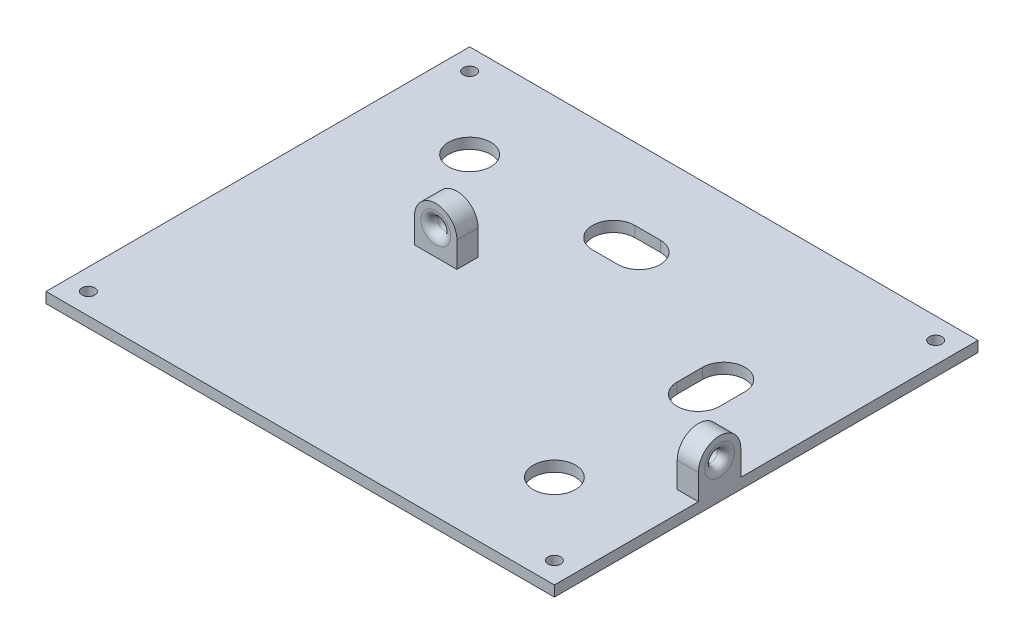
ISO-10303-21;
HEADER;
FILE_DESCRIPTION(('STEP AP214'),'2;1');
FILE_NAME('part.step','',(''),(''),'','','');
FILE_SCHEMA(('AUTOMOTIVE_DESIGN { 1 0 10303 214 1 1 1 1 }'));
ENDSEC;
DATA;
#1=APPLICATION_CONTEXT('core data for automotive mechanical design processes');
#2=APPLICATION_PROTOCOL_DEFINITION('international standard','automotive_design',2000,#1);
#3=PRODUCT_CONTEXT('',#1,'mechanical');
#4=PRODUCT('Part','Part','',(#3));
#5=PRODUCT_RELATED_PRODUCT_CATEGORY('part','',(#4));
#6=PRODUCT_DEFINITION_FORMATION('','',#4);
#7=PRODUCT_DEFINITION_CONTEXT('part definition',#1,'design');
#8=PRODUCT_DEFINITION('design','',#6,#7);
#9=PRODUCT_DEFINITION_SHAPE('','',#8);
#10=(LENGTH_UNIT() NAMED_UNIT(*) SI_UNIT(.MILLI.,.METRE.));
#11=(NAMED_UNIT(*) PLANE_ANGLE_UNIT() SI_UNIT($,.RADIAN.));
#12=(NAMED_UNIT(*) SI_UNIT($,.STERADIAN.) SOLID_ANGLE_UNIT());
#13=UNCERTAINTY_MEASURE_WITH_UNIT(LENGTH_MEASURE(1.E-05),#10,'distance_accuracy_value','');
#14=(GEOMETRIC_REPRESENTATION_CONTEXT(3) GLOBAL_UNCERTAINTY_ASSIGNED_CONTEXT((#13)) GLOBAL_UNIT_ASSIGNED_CONTEXT((#10,
#11,#12)) REPRESENTATION_CONTEXT('',''));
#15=CARTESIAN_POINT('',(0.,0.,0.));
#16=DIRECTION('',(0.,0.,1.));
#17=DIRECTION('',(1.,0.,0.));
#18=AXIS2_PLACEMENT_3D('',#15,#16,#17);
#19=CARTESIAN_POINT('',(-60.,2.5,-50.));
#20=DIRECTION('',(0.,0.,1.));
#21=DIRECTION('',(1.,0.,0.));
#22=AXIS2_PLACEMENT_3D('',#19,#20,#21);
#23=PLANE('',#22);
#24=DIRECTION('',(0.,-1.,0.));
#25=VECTOR('',#24,1.);
#26=CARTESIAN_POINT('',(-60.,2.5,-50.));
#27=LINE('',#26,#25);
#28=CARTESIAN_POINT('',(-60.,2.5,-50.));
#29=VERTEX_POINT('',#28);
#30=CARTESIAN_POINT('',(-60.,0.,-50.));
#31=VERTEX_POINT('',#30);
#32=EDGE_CURVE('E305',#29,#31,#27,.T.);
#33=ORIENTED_EDGE('',*,*,#32,.F.);
#34=DIRECTION('',(-1.,0.,0.));
#35=VECTOR('',#34,1.);
#36=CARTESIAN_POINT('',(-60.,2.5,-50.));
#37=LINE('',#36,#35);
#38=CARTESIAN_POINT('',(60.,2.5,-50.));
#39=VERTEX_POINT('',#38);
#40=EDGE_CURVE('E282',#39,#29,#37,.T.);
#41=ORIENTED_EDGE('',*,*,#40,.F.);
#42=DIRECTION('',(0.,-1.,0.));
#43=VECTOR('',#42,1.);
#44=CARTESIAN_POINT('',(60.,2.5,-50.));
#45=LINE('',#44,#43);
#46=CARTESIAN_POINT('',(60.,0.,-50.));
#47=VERTEX_POINT('',#46);
#48=EDGE_CURVE('E308',#39,#47,#45,.T.);
#49=ORIENTED_EDGE('',*,*,#48,.T.);
#50=DIRECTION('',(-1.,0.,0.));
#51=VECTOR('',#50,1.);
#52=CARTESIAN_POINT('',(-60.,0.,-50.));
#53=LINE('',#52,#51);
#54=EDGE_CURVE('E293',#47,#31,#53,.T.);
#55=ORIENTED_EDGE('',*,*,#54,.T.);
#56=EDGE_LOOP('',(#33,#41,#49,#55));
#57=FACE_BOUND('',#56,.T.);
#58=ADVANCED_FACE('F33',(#57),#23,.F.);
#59=CARTESIAN_POINT('',(55.,17.5,16.));
#60=DIRECTION('',(0.,0.,-1.));
#61=DIRECTION('',(-1.,0.,0.));
#62=AXIS2_PLACEMENT_3D('',#59,#60,#61);
#63=PLANE('',#62);
#64=DIRECTION('',(-1.,0.,0.));
#65=VECTOR('',#64,1.);
#66=CARTESIAN_POINT('',(60.,8.5,16.));
#67=LINE('',#66,#65);
#68=CARTESIAN_POINT('',(60.,8.5,16.));
#69=VERTEX_POINT('',#68);
#70=CARTESIAN_POINT('',(55.,8.5,16.));
#71=VERTEX_POINT('',#70);
#72=EDGE_CURVE('E168',#69,#71,#67,.T.);
#73=ORIENTED_EDGE('',*,*,#72,.T.);
#74=DIRECTION('',(0.,-1.,0.));
#75=VECTOR('',#74,1.);
#76=CARTESIAN_POINT('',(55.,17.5,16.));
#77=LINE('',#76,#75);
#78=CARTESIAN_POINT('',(55.,2.5,16.));
#79=VERTEX_POINT('',#78);
#80=EDGE_CURVE('E190',#71,#79,#77,.T.);
#81=ORIENTED_EDGE('',*,*,#80,.T.);
#82=DIRECTION('',(1.,0.,0.));
#83=VECTOR('',#82,1.);
#84=CARTESIAN_POINT('',(55.,2.5,16.));
#85=LINE('',#84,#83);
#86=CARTESIAN_POINT('',(60.,2.5,16.));
#87=VERTEX_POINT('',#86);
#88=EDGE_CURVE('E189',#79,#87,#85,.T.);
#89=ORIENTED_EDGE('',*,*,#88,.T.);
#90=DIRECTION('',(0.,-1.,0.));
#91=VECTOR('',#90,1.);
#92=CARTESIAN_POINT('',(60.,17.5,16.));
#93=LINE('',#92,#91);
#94=EDGE_CURVE('E181',#69,#87,#93,.T.);
#95=ORIENTED_EDGE('',*,*,#94,.F.);
#96=EDGE_LOOP('',(#73,#81,#89,#95));
#97=FACE_BOUND('',#96,.T.);
#98=ADVANCED_FACE('F187',(#97),#63,.F.);
#99=CARTESIAN_POINT('',(-16.,17.5,-8.00000000000001));
#100=DIRECTION('',(-1.,0.,0.));
#101=DIRECTION('',(0.,0.,1.));
#102=AXIS2_PLACEMENT_3D('',#99,#100,#101);
#103=PLANE('',#102);
#104=DIRECTION('',(0.,0.,1.));
#105=VECTOR('',#104,1.);
#106=CARTESIAN_POINT('',(-16.,8.5,-50.));
#107=LINE('',#106,#105);
#108=CARTESIAN_POINT('',(-16.,8.5,-8.00000000000001));
#109=VERTEX_POINT('',#108);
#110=CARTESIAN_POINT('',(-16.,8.5,-3.00000000000001));
#111=VERTEX_POINT('',#110);
#112=EDGE_CURVE('E56',#109,#111,#107,.T.);
#113=ORIENTED_EDGE('',*,*,#112,.T.);
#114=DIRECTION('',(0.,-1.,0.));
#115=VECTOR('',#114,1.);
#116=CARTESIAN_POINT('',(-16.,17.5,-3.00000000000001));
#117=LINE('',#116,#115);
#118=CARTESIAN_POINT('',(-16.,2.5,-3.00000000000001));
#119=VERTEX_POINT('',#118);
#120=EDGE_CURVE('E213',#111,#119,#117,.T.);
#121=ORIENTED_EDGE('',*,*,#120,.T.);
#122=DIRECTION('',(0.,0.,-1.));
#123=VECTOR('',#122,1.);
#124=CARTESIAN_POINT('',(-16.,2.5,-8.00000000000001));
#125=LINE('',#124,#123);
#126=CARTESIAN_POINT('',(-16.,2.5,-8.00000000000001));
#127=VERTEX_POINT('',#126);
#128=EDGE_CURVE('E203',#119,#127,#125,.T.);
#129=ORIENTED_EDGE('',*,*,#128,.T.);
#130=DIRECTION('',(0.,-1.,0.));
#131=VECTOR('',#130,1.);
#132=CARTESIAN_POINT('',(-16.,17.5,-8.00000000000001));
#133=LINE('',#132,#131);
#134=EDGE_CURVE('E211',#109,#127,#133,.T.);
#135=ORIENTED_EDGE('',*,*,#134,.F.);
#136=EDGE_LOOP('',(#113,#121,#129,#135));
#137=FACE_BOUND('',#136,.T.);
#138=ADVANCED_FACE('F452',(#137),#103,.F.);
#139=CARTESIAN_POINT('',(0.,2.5,0.));
#140=DIRECTION('',(0.,1.,0.));
#141=DIRECTION('',(0.,0.,1.));
#142=AXIS2_PLACEMENT_3D('',#139,#140,#141);
#143=PLANE('',#142);
#144=ORIENTED_EDGE('',*,*,#40,.T.);
#145=DIRECTION('',(0.,0.,1.));
#146=VECTOR('',#145,1.);
#147=CARTESIAN_POINT('',(-60.,2.5,-50.));
#148=LINE('',#147,#146);
#149=CARTESIAN_POINT('',(-60.,2.5,50.));
#150=VERTEX_POINT('',#149);
#151=EDGE_CURVE('E285',#29,#150,#148,.T.);
#152=ORIENTED_EDGE('',*,*,#151,.T.);
#153=DIRECTION('',(1.,0.,0.));
#154=VECTOR('',#153,1.);
#155=CARTESIAN_POINT('',(-60.,2.5,50.));
#156=LINE('',#155,#154);
#157=CARTESIAN_POINT('',(60.,2.5,50.));
#158=VERTEX_POINT('',#157);
#159=EDGE_CURVE('E287',#150,#158,#156,.T.);
#160=ORIENTED_EDGE('',*,*,#159,.T.);
#161=DIRECTION('',(0.,0.,-1.));
#162=VECTOR('',#161,1.);
#163=CARTESIAN_POINT('',(60.,2.5,-50.));
#164=LINE('',#163,#162);
#165=EDGE_CURVE('E280',#158,#87,#164,.T.);
#166=ORIENTED_EDGE('',*,*,#165,.T.);
#167=ORIENTED_EDGE('',*,*,#88,.F.);
#168=DIRECTION('',(0.,0.,1.));
#169=VECTOR('',#168,1.);
#170=CARTESIAN_POINT('',(55.,2.5,16.));
#171=LINE('',#170,#169);
#172=CARTESIAN_POINT('',(55.,2.5,5.99999999999999));
#173=VERTEX_POINT('',#172);
#174=EDGE_CURVE('E395',#173,#79,#171,.T.);
#175=ORIENTED_EDGE('',*,*,#174,.F.);
#176=DIRECTION('',(-1.,0.,0.));
#177=VECTOR('',#176,1.);
#178=CARTESIAN_POINT('',(55.,2.5,5.99999999999999));
#179=LINE('',#178,#177);
#180=CARTESIAN_POINT('',(60.,2.5,6.));
#181=VERTEX_POINT('',#180);
#182=EDGE_CURVE('E405',#181,#173,#179,.T.);
#183=ORIENTED_EDGE('',*,*,#182,.F.);
#184=EDGE_CURVE('E283',#181,#39,#164,.T.);
#185=ORIENTED_EDGE('',*,*,#184,.T.);
#186=EDGE_LOOP('',(#144,#152,#160,#166,#167,#175,#183,#185));
#187=FACE_BOUND('',#186,.T.);
#188=DIRECTION('',(-1.,0.,0.));
#189=VECTOR('',#188,1.);
#190=CARTESIAN_POINT('',(-4.00000000000001,2.5,-33.));
#191=LINE('',#190,#189);
#192=CARTESIAN_POINT('',(1.99999999999999,2.5,-33.));
#193=VERTEX_POINT('',#192);
#194=CARTESIAN_POINT('',(-4.00000000000001,2.5,-33.));
#195=VERTEX_POINT('',#194);
#196=EDGE_CURVE('E225',#193,#195,#191,.T.);
#197=ORIENTED_EDGE('',*,*,#196,.F.);
#198=CARTESIAN_POINT('',(1.99999999999999,2.5,-28.));
#199=DIRECTION('',(0.,1.,0.));
#200=DIRECTION('',(0.,0.,1.));
#201=AXIS2_PLACEMENT_3D('',#198,#199,#200);
#202=CIRCLE('',#201,5.);
#203=CARTESIAN_POINT('',(1.99999999999999,2.5,-23.));
#204=VERTEX_POINT('',#203);
#205=EDGE_CURVE('E221',#204,#193,#202,.T.);
#206=ORIENTED_EDGE('',*,*,#205,.F.);
#207=DIRECTION('',(1.,0.,0.));
#208=VECTOR('',#207,1.);
#209=CARTESIAN_POINT('',(-4.00000000000001,2.5,-23.));
#210=LINE('',#209,#208);
#211=CARTESIAN_POINT('',(-4.00000000000001,2.5,-23.));
#212=VERTEX_POINT('',#211);
#213=EDGE_CURVE('E218',#212,#204,#210,.T.);
#214=ORIENTED_EDGE('',*,*,#213,.F.);
#215=CARTESIAN_POINT('',(-4.00000000000001,2.5,-28.));
#216=DIRECTION('',(0.,1.,0.));
#217=DIRECTION('',(0.,0.,1.));
#218=AXIS2_PLACEMENT_3D('',#215,#216,#217);
#219=CIRCLE('',#218,5.);
#220=EDGE_CURVE('E258',#195,#212,#219,.T.);
#221=ORIENTED_EDGE('',*,*,#220,.F.);
#222=EDGE_LOOP('',(#197,#206,#214,#221));
#223=FACE_BOUND('',#222,.T.);
#224=DIRECTION('',(0.,0.,1.));
#225=VECTOR('',#224,1.);
#226=CARTESIAN_POINT('',(33.,2.5,-6.00000000000001));
#227=LINE('',#226,#225);
#228=CARTESIAN_POINT('',(33.,2.5,-12.));
#229=VERTEX_POINT('',#228);
#230=CARTESIAN_POINT('',(33.,2.5,-6.00000000000001));
#231=VERTEX_POINT('',#230);
#232=EDGE_CURVE('E237',#229,#231,#227,.T.);
#233=ORIENTED_EDGE('',*,*,#232,.F.);
#234=CARTESIAN_POINT('',(38.,2.5,-12.));
#235=DIRECTION('',(0.,1.,0.));
#236=DIRECTION('',(0.,0.,1.));
#237=AXIS2_PLACEMENT_3D('',#234,#235,#236);
#238=CIRCLE('',#237,5.);
#239=CARTESIAN_POINT('',(43.,2.5,-12.));
#240=VERTEX_POINT('',#239);
#241=EDGE_CURVE('E234',#240,#229,#238,.T.);
#242=ORIENTED_EDGE('',*,*,#241,.F.);
#243=DIRECTION('',(0.,0.,-1.));
#244=VECTOR('',#243,1.);
#245=CARTESIAN_POINT('',(43.,2.5,-6.00000000000001));
#246=LINE('',#245,#244);
#247=CARTESIAN_POINT('',(43.,2.5,-6.00000000000001));
#248=VERTEX_POINT('',#247);
#249=EDGE_CURVE('E217',#248,#240,#246,.T.);
#250=ORIENTED_EDGE('',*,*,#249,.F.);
#251=CARTESIAN_POINT('',(38.,2.5,-6.00000000000001));
#252=DIRECTION('',(0.,1.,0.));
#253=DIRECTION('',(0.,0.,1.));
#254=AXIS2_PLACEMENT_3D('',#251,#252,#253);
#255=CIRCLE('',#254,5.);
#256=EDGE_CURVE('E261',#231,#248,#255,.T.);
#257=ORIENTED_EDGE('',*,*,#256,.F.);
#258=EDGE_LOOP('',(#233,#242,#250,#257));
#259=FACE_BOUND('',#258,.T.);
#260=CARTESIAN_POINT('',(-38.,2.5,-28.));
#261=DIRECTION('',(0.,1.,0.));
#262=DIRECTION('',(0.,0.,1.));
#263=AXIS2_PLACEMENT_3D('',#260,#261,#262);
#264=CIRCLE('',#263,5.);
#265=CARTESIAN_POINT('',(-38.,2.5,-23.));
#266=VERTEX_POINT('',#265);
#267=EDGE_CURVE('E254',#266,#266,#264,.T.);
#268=ORIENTED_EDGE('',*,*,#267,.F.);
#269=EDGE_LOOP('',(#268));
#270=FACE_BOUND('',#269,.T.);
#271=CARTESIAN_POINT('',(38.,2.5,28.));
#272=DIRECTION('',(0.,1.,0.));
#273=DIRECTION('',(0.,0.,1.));
#274=AXIS2_PLACEMENT_3D('',#271,#272,#273);
#275=CIRCLE('',#274,5.);
#276=CARTESIAN_POINT('',(38.,2.5,33.));
#277=VERTEX_POINT('',#276);
#278=EDGE_CURVE('E253',#277,#277,#275,.T.);
#279=ORIENTED_EDGE('',*,*,#278,.F.);
#280=EDGE_LOOP('',(#279));
#281=FACE_BOUND('',#280,.T.);
#282=CARTESIAN_POINT('',(-55.,2.5,45.));
#283=DIRECTION('',(0.,1.,0.));
#284=DIRECTION('',(0.,0.,1.));
#285=AXIS2_PLACEMENT_3D('',#282,#283,#284);
#286=CIRCLE('',#285,1.5);
#287=CARTESIAN_POINT('',(-55.,2.5,46.5));
#288=VERTEX_POINT('',#287);
#289=EDGE_CURVE('E273',#288,#288,#286,.T.);
#290=ORIENTED_EDGE('',*,*,#289,.F.);
#291=EDGE_LOOP('',(#290));
#292=FACE_BOUND('',#291,.T.);
#293=CARTESIAN_POINT('',(55.,2.5,45.));
#294=DIRECTION('',(0.,1.,0.));
#295=DIRECTION('',(0.,0.,1.));
#296=AXIS2_PLACEMENT_3D('',#293,#294,#295);
#297=CIRCLE('',#296,1.5);
#298=CARTESIAN_POINT('',(55.,2.5,46.5));
#299=VERTEX_POINT('',#298);
#300=EDGE_CURVE('E270',#299,#299,#297,.T.);
#301=ORIENTED_EDGE('',*,*,#300,.F.);
#302=EDGE_LOOP('',(#301));
#303=FACE_BOUND('',#302,.T.);
#304=CARTESIAN_POINT('',(55.,2.5,-45.));
#305=DIRECTION('',(0.,1.,0.));
#306=DIRECTION('',(0.,0.,1.));
#307=AXIS2_PLACEMENT_3D('',#304,#305,#306);
#308=CIRCLE('',#307,1.5);
#309=CARTESIAN_POINT('',(55.,2.5,-43.5));
#310=VERTEX_POINT('',#309);
#311=EDGE_CURVE('E266',#310,#310,#308,.T.);
#312=ORIENTED_EDGE('',*,*,#311,.F.);
#313=EDGE_LOOP('',(#312));
#314=FACE_BOUND('',#313,.T.);
#315=CARTESIAN_POINT('',(-55.,2.5,-45.));
#316=DIRECTION('',(0.,1.,0.));
#317=DIRECTION('',(0.,0.,1.));
#318=AXIS2_PLACEMENT_3D('',#315,#316,#317);
#319=CIRCLE('',#318,1.5);
#320=CARTESIAN_POINT('',(-55.,2.5,-43.5));
#321=VERTEX_POINT('',#320);
#322=EDGE_CURVE('E269',#321,#321,#319,.T.);
#323=ORIENTED_EDGE('',*,*,#322,.F.);
#324=EDGE_LOOP('',(#323));
#325=FACE_BOUND('',#324,.T.);
#326=DIRECTION('',(1.,0.,0.));
#327=VECTOR('',#326,1.);
#328=CARTESIAN_POINT('',(-26.,2.5,-3.00000000000001));
#329=LINE('',#328,#327);
#330=CARTESIAN_POINT('',(-26.,2.5,-3.00000000000001));
#331=VERTEX_POINT('',#330);
#332=EDGE_CURVE('E200',#331,#119,#329,.T.);
#333=ORIENTED_EDGE('',*,*,#332,.F.);
#334=DIRECTION('',(0.,0.,1.));
#335=VECTOR('',#334,1.);
#336=CARTESIAN_POINT('',(-26.,2.5,-8.00000000000001));
#337=LINE('',#336,#335);
#338=CARTESIAN_POINT('',(-26.,2.5,-8.00000000000001));
#339=VERTEX_POINT('',#338);
#340=EDGE_CURVE('E192',#339,#331,#337,.T.);
#341=ORIENTED_EDGE('',*,*,#340,.F.);
#342=DIRECTION('',(-1.,0.,0.));
#343=VECTOR('',#342,1.);
#344=CARTESIAN_POINT('',(-26.,2.5,-8.00000000000001));
#345=LINE('',#344,#343);
#346=EDGE_CURVE('E206',#127,#339,#345,.T.);
#347=ORIENTED_EDGE('',*,*,#346,.F.);
#348=ORIENTED_EDGE('',*,*,#128,.F.);
#349=EDGE_LOOP('',(#333,#341,#347,#348));
#350=FACE_BOUND('',#349,.T.);
#351=ADVANCED_FACE('F413',(#187,#223,#259,#270,#281,#292,#303,#314,#325,#350),#143,.T.);
#352=CARTESIAN_POINT('',(38.,-2.5,-6.00000000000001));
#353=DIRECTION('',(0.,1.,0.));
#354=DIRECTION('',(0.,0.,1.));
#355=AXIS2_PLACEMENT_3D('',#352,#353,#354);
#356=CYLINDRICAL_SURFACE('',#355,5.);
#357=DIRECTION('',(0.,1.,0.));
#358=VECTOR('',#357,1.);
#359=CARTESIAN_POINT('',(33.,-2.5,-6.00000000000001));
#360=LINE('',#359,#358);
#361=CARTESIAN_POINT('',(33.,0.,-6.00000000000001));
#362=VERTEX_POINT('',#361);
#363=EDGE_CURVE('E339',#231,#362,#360,.F.);
#364=ORIENTED_EDGE('',*,*,#363,.F.);
#365=ORIENTED_EDGE('',*,*,#256,.T.);
#366=DIRECTION('',(0.,1.,0.));
#367=VECTOR('',#366,1.);
#368=CARTESIAN_POINT('',(43.,-2.5,-6.00000000000001));
#369=LINE('',#368,#367);
#370=CARTESIAN_POINT('',(43.,0.,-6.00000000000001));
#371=VERTEX_POINT('',#370);
#372=EDGE_CURVE('E336',#248,#371,#369,.F.);
#373=ORIENTED_EDGE('',*,*,#372,.T.);
#374=CARTESIAN_POINT('',(38.,0.,-6.00000000000001));
#375=DIRECTION('',(0.,1.,0.));
#376=DIRECTION('',(0.,0.,1.));
#377=AXIS2_PLACEMENT_3D('',#374,#375,#376);
#378=CIRCLE('',#377,5.);
#379=EDGE_CURVE('E324',#362,#371,#378,.T.);
#380=ORIENTED_EDGE('',*,*,#379,.F.);
#381=EDGE_LOOP('',(#364,#365,#373,#380));
#382=FACE_BOUND('',#381,.T.);
#383=ADVANCED_FACE('F530',(#382),#356,.F.);
#384=CARTESIAN_POINT('',(-4.00000000000001,-2.5,-28.));
#385=DIRECTION('',(0.,1.,0.));
#386=DIRECTION('',(0.,0.,1.));
#387=AXIS2_PLACEMENT_3D('',#384,#385,#386);
#388=CYLINDRICAL_SURFACE('',#387,5.);
#389=DIRECTION('',(0.,1.,0.));
#390=VECTOR('',#389,1.);
#391=CARTESIAN_POINT('',(-4.00000000000001,-2.5,-33.));
#392=LINE('',#391,#390);
#393=CARTESIAN_POINT('',(-4.00000000000001,0.,-33.));
#394=VERTEX_POINT('',#393);
#395=EDGE_CURVE('E334',#195,#394,#392,.F.);
#396=ORIENTED_EDGE('',*,*,#395,.F.);
#397=ORIENTED_EDGE('',*,*,#220,.T.);
#398=DIRECTION('',(0.,1.,0.));
#399=VECTOR('',#398,1.);
#400=CARTESIAN_POINT('',(-4.00000000000001,-2.5,-23.));
#401=LINE('',#400,#399);
#402=CARTESIAN_POINT('',(-4.00000000000001,0.,-23.));
#403=VERTEX_POINT('',#402);
#404=EDGE_CURVE('E311',#212,#403,#401,.F.);
#405=ORIENTED_EDGE('',*,*,#404,.T.);
#406=CARTESIAN_POINT('',(-4.00000000000001,0.,-28.));
#407=DIRECTION('',(0.,1.,0.));
#408=DIRECTION('',(0.,0.,1.));
#409=AXIS2_PLACEMENT_3D('',#406,#407,#408);
#410=CIRCLE('',#409,5.);
#411=EDGE_CURVE('E327',#394,#403,#410,.T.);
#412=ORIENTED_EDGE('',*,*,#411,.F.);
#413=EDGE_LOOP('',(#396,#397,#405,#412));
#414=FACE_BOUND('',#413,.T.);
#415=ADVANCED_FACE('F458',(#414),#388,.F.);
#416=CARTESIAN_POINT('',(60.,2.5,-50.));
#417=DIRECTION('',(-1.,0.,0.));
#418=DIRECTION('',(0.,0.,1.));
#419=AXIS2_PLACEMENT_3D('',#416,#417,#418);
#420=PLANE('',#419);
#421=CARTESIAN_POINT('',(60.,8.5,11.));
#422=DIRECTION('',(-1.,0.,0.));
#423=DIRECTION('',(0.,0.,1.));
#424=AXIS2_PLACEMENT_3D('',#421,#422,#423);
#425=CIRCLE('',#424,3.5);
#426=CARTESIAN_POINT('',(60.,8.5,14.5));
#427=VERTEX_POINT('',#426);
#428=EDGE_CURVE('E356',#427,#427,#425,.T.);
#429=ORIENTED_EDGE('',*,*,#428,.T.);
#430=EDGE_LOOP('',(#429));
#431=FACE_BOUND('',#430,.T.);
#432=DIRECTION('',(0.,-1.,0.));
#433=VECTOR('',#432,1.);
#434=CARTESIAN_POINT('',(60.,17.5,6.));
#435=LINE('',#434,#433);
#436=CARTESIAN_POINT('',(60.,8.5,6.));
#437=VERTEX_POINT('',#436);
#438=EDGE_CURVE('E184',#437,#181,#435,.T.);
#439=ORIENTED_EDGE('',*,*,#438,.F.);
#440=CARTESIAN_POINT('',(60.,8.5,11.));
#441=DIRECTION('',(1.,0.,0.));
#442=DIRECTION('',(0.,0.,-1.));
#443=AXIS2_PLACEMENT_3D('',#440,#441,#442);
#444=CIRCLE('',#443,5.);
#445=EDGE_CURVE('E48',#437,#69,#444,.T.);
#446=ORIENTED_EDGE('',*,*,#445,.T.);
#447=ORIENTED_EDGE('',*,*,#94,.T.);
#448=ORIENTED_EDGE('',*,*,#165,.F.);
#449=DIRECTION('',(0.,-1.,0.));
#450=VECTOR('',#449,1.);
#451=CARTESIAN_POINT('',(60.,2.5,50.));
#452=LINE('',#451,#450);
#453=CARTESIAN_POINT('',(60.,0.,50.));
#454=VERTEX_POINT('',#453);
#455=EDGE_CURVE('E289',#158,#454,#452,.T.);
#456=ORIENTED_EDGE('',*,*,#455,.T.);
#457=DIRECTION('',(0.,0.,-1.));
#458=VECTOR('',#457,1.);
#459=CARTESIAN_POINT('',(60.,0.,-50.));
#460=LINE('',#459,#458);
#461=EDGE_CURVE('E290',#454,#47,#460,.T.);
#462=ORIENTED_EDGE('',*,*,#461,.T.);
#463=ORIENTED_EDGE('',*,*,#48,.F.);
#464=ORIENTED_EDGE('',*,*,#184,.F.);
#465=EDGE_LOOP('',(#439,#446,#447,#448,#456,#462,#463,#464));
#466=FACE_BOUND('',#465,.T.);
#467=ADVANCED_FACE('F179',(#431,#466),#420,.F.);
#468=CARTESIAN_POINT('',(-60.,2.5,-50.));
#469=DIRECTION('',(1.,0.,0.));
#470=DIRECTION('',(0.,0.,-1.));
#471=AXIS2_PLACEMENT_3D('',#468,#469,#470);
#472=PLANE('',#471);
#473=DIRECTION('',(0.,0.,1.));
#474=VECTOR('',#473,1.);
#475=CARTESIAN_POINT('',(-60.,0.,-50.));
#476=LINE('',#475,#474);
#477=CARTESIAN_POINT('',(-60.,0.,50.));
#478=VERTEX_POINT('',#477);
#479=EDGE_CURVE('E296',#31,#478,#476,.T.);
#480=ORIENTED_EDGE('',*,*,#479,.T.);
#481=DIRECTION('',(0.,-1.,0.));
#482=VECTOR('',#481,1.);
#483=CARTESIAN_POINT('',(-60.,2.5,50.));
#484=LINE('',#483,#482);
#485=EDGE_CURVE('E302',#150,#478,#484,.T.);
#486=ORIENTED_EDGE('',*,*,#485,.F.);
#487=ORIENTED_EDGE('',*,*,#151,.F.);
#488=ORIENTED_EDGE('',*,*,#32,.T.);
#489=EDGE_LOOP('',(#480,#486,#487,#488));
#490=FACE_BOUND('',#489,.T.);
#491=ADVANCED_FACE('F424',(#490),#472,.F.);
#492=CARTESIAN_POINT('',(-60.,2.5,50.));
#493=DIRECTION('',(0.,0.,-1.));
#494=DIRECTION('',(-1.,0.,0.));
#495=AXIS2_PLACEMENT_3D('',#492,#493,#494);
#496=PLANE('',#495);
#497=DIRECTION('',(1.,0.,0.));
#498=VECTOR('',#497,1.);
#499=CARTESIAN_POINT('',(-60.,0.,50.));
#500=LINE('',#499,#498);
#501=EDGE_CURVE('E298',#478,#454,#500,.T.);
#502=ORIENTED_EDGE('',*,*,#501,.T.);
#503=ORIENTED_EDGE('',*,*,#455,.F.);
#504=ORIENTED_EDGE('',*,*,#159,.F.);
#505=ORIENTED_EDGE('',*,*,#485,.T.);
#506=EDGE_LOOP('',(#502,#503,#504,#505));
#507=FACE_BOUND('',#506,.T.);
#508=ADVANCED_FACE('F428',(#507),#496,.F.);
#509=CARTESIAN_POINT('',(0.,0.,0.));
#510=DIRECTION('',(0.,1.,0.));
#511=DIRECTION('',(0.,0.,1.));
#512=AXIS2_PLACEMENT_3D('',#509,#510,#511);
#513=PLANE('',#512);
#514=CARTESIAN_POINT('',(-38.,0.,-28.));
#515=DIRECTION('',(0.,1.,0.));
#516=DIRECTION('',(0.,0.,1.));
#517=AXIS2_PLACEMENT_3D('',#514,#515,#516);
#518=CIRCLE('',#517,5.);
#519=CARTESIAN_POINT('',(-38.,0.,-23.));
#520=VERTEX_POINT('',#519);
#521=EDGE_CURVE('E276',#520,#520,#518,.T.);
#522=ORIENTED_EDGE('',*,*,#521,.T.);
#523=EDGE_LOOP('',(#522));
#524=FACE_BOUND('',#523,.T.);
#525=CARTESIAN_POINT('',(1.99999999999999,0.,-28.));
#526=DIRECTION('',(0.,1.,0.));
#527=DIRECTION('',(0.,0.,1.));
#528=AXIS2_PLACEMENT_3D('',#525,#526,#527);
#529=CIRCLE('',#528,5.);
#530=CARTESIAN_POINT('',(1.99999999999999,0.,-23.));
#531=VERTEX_POINT('',#530);
#532=CARTESIAN_POINT('',(1.99999999999999,0.,-33.));
#533=VERTEX_POINT('',#532);
#534=EDGE_CURVE('E344',#531,#533,#529,.T.);
#535=ORIENTED_EDGE('',*,*,#534,.T.);
#536=DIRECTION('',(-1.,0.,0.));
#537=VECTOR('',#536,1.);
#538=CARTESIAN_POINT('',(0.,0.,-33.));
#539=LINE('',#538,#537);
#540=EDGE_CURVE('E244',#533,#394,#539,.T.);
#541=ORIENTED_EDGE('',*,*,#540,.T.);
#542=ORIENTED_EDGE('',*,*,#411,.T.);
#543=DIRECTION('',(1.,0.,0.));
#544=VECTOR('',#543,1.);
#545=CARTESIAN_POINT('',(0.,0.,-23.));
#546=LINE('',#545,#544);
#547=EDGE_CURVE('E230',#403,#531,#546,.T.);
#548=ORIENTED_EDGE('',*,*,#547,.T.);
#549=EDGE_LOOP('',(#535,#541,#542,#548));
#550=FACE_BOUND('',#549,.T.);
#551=CARTESIAN_POINT('',(38.,0.,-12.));
#552=DIRECTION('',(0.,1.,0.));
#553=DIRECTION('',(0.,0.,1.));
#554=AXIS2_PLACEMENT_3D('',#551,#552,#553);
#555=CIRCLE('',#554,5.);
#556=CARTESIAN_POINT('',(43.,0.,-12.));
#557=VERTEX_POINT('',#556);
#558=CARTESIAN_POINT('',(33.,0.,-12.));
#559=VERTEX_POINT('',#558);
#560=EDGE_CURVE('E341',#557,#559,#555,.T.);
#561=ORIENTED_EDGE('',*,*,#560,.T.);
#562=DIRECTION('',(0.,0.,1.));
#563=VECTOR('',#562,1.);
#564=CARTESIAN_POINT('',(33.,0.,0.));
#565=LINE('',#564,#563);
#566=EDGE_CURVE('E250',#559,#362,#565,.T.);
#567=ORIENTED_EDGE('',*,*,#566,.T.);
#568=ORIENTED_EDGE('',*,*,#379,.T.);
#569=DIRECTION('',(0.,0.,-1.));
#570=VECTOR('',#569,1.);
#571=CARTESIAN_POINT('',(43.,0.,0.));
#572=LINE('',#571,#570);
#573=EDGE_CURVE('E247',#371,#557,#572,.T.);
#574=ORIENTED_EDGE('',*,*,#573,.T.);
#575=EDGE_LOOP('',(#561,#567,#568,#574));
#576=FACE_BOUND('',#575,.T.);
#577=CARTESIAN_POINT('',(38.,0.,28.));
#578=DIRECTION('',(0.,1.,0.));
#579=DIRECTION('',(0.,0.,1.));
#580=AXIS2_PLACEMENT_3D('',#577,#578,#579);
#581=CIRCLE('',#580,5.);
#582=CARTESIAN_POINT('',(38.,0.,33.));
#583=VERTEX_POINT('',#582);
#584=EDGE_CURVE('E257',#583,#583,#581,.T.);
#585=ORIENTED_EDGE('',*,*,#584,.T.);
#586=EDGE_LOOP('',(#585));
#587=FACE_BOUND('',#586,.T.);
#588=CARTESIAN_POINT('',(-55.,0.,45.));
#589=DIRECTION('',(0.,1.,0.));
#590=DIRECTION('',(0.,0.,1.));
#591=AXIS2_PLACEMENT_3D('',#588,#589,#590);
#592=CIRCLE('',#591,1.5);
#593=CARTESIAN_POINT('',(-55.,0.,46.5));
#594=VERTEX_POINT('',#593);
#595=EDGE_CURVE('E294',#594,#594,#592,.T.);
#596=ORIENTED_EDGE('',*,*,#595,.T.);
#597=EDGE_LOOP('',(#596));
#598=FACE_BOUND('',#597,.T.);
#599=CARTESIAN_POINT('',(55.,0.,45.));
#600=DIRECTION('',(0.,1.,0.));
#601=DIRECTION('',(0.,0.,1.));
#602=AXIS2_PLACEMENT_3D('',#599,#600,#601);
#603=CIRCLE('',#602,1.5);
#604=CARTESIAN_POINT('',(55.,0.,46.5));
#605=VERTEX_POINT('',#604);
#606=EDGE_CURVE('E317',#605,#605,#603,.T.);
#607=ORIENTED_EDGE('',*,*,#606,.T.);
#608=EDGE_LOOP('',(#607));
#609=FACE_BOUND('',#608,.T.);
#610=CARTESIAN_POINT('',(55.,0.,-45.));
#611=DIRECTION('',(0.,1.,0.));
#612=DIRECTION('',(0.,0.,1.));
#613=AXIS2_PLACEMENT_3D('',#610,#611,#612);
#614=CIRCLE('',#613,1.5);
#615=CARTESIAN_POINT('',(55.,0.,-43.5));
#616=VERTEX_POINT('',#615);
#617=EDGE_CURVE('E314',#616,#616,#614,.T.);
#618=ORIENTED_EDGE('',*,*,#617,.T.);
#619=EDGE_LOOP('',(#618));
#620=FACE_BOUND('',#619,.T.);
#621=CARTESIAN_POINT('',(-55.,0.,-45.));
#622=DIRECTION('',(0.,1.,0.));
#623=DIRECTION('',(0.,0.,1.));
#624=AXIS2_PLACEMENT_3D('',#621,#622,#623);
#625=CIRCLE('',#624,1.5);
#626=CARTESIAN_POINT('',(-55.,0.,-43.5));
#627=VERTEX_POINT('',#626);
#628=EDGE_CURVE('E279',#627,#627,#625,.T.);
#629=ORIENTED_EDGE('',*,*,#628,.T.);
#630=EDGE_LOOP('',(#629));
#631=FACE_BOUND('',#630,.T.);
#632=ORIENTED_EDGE('',*,*,#461,.F.);
#633=ORIENTED_EDGE('',*,*,#501,.F.);
#634=ORIENTED_EDGE('',*,*,#479,.F.);
#635=ORIENTED_EDGE('',*,*,#54,.F.);
#636=EDGE_LOOP('',(#632,#633,#634,#635));
#637=FACE_BOUND('',#636,.T.);
#638=ADVANCED_FACE('F432',(#524,#550,#576,#587,#598,#609,#620,#631,#637),#513,.F.);
#639=CARTESIAN_POINT('',(-55.,-2.5,-45.));
#640=DIRECTION('',(0.,1.,0.));
#641=DIRECTION('',(0.,0.,1.));
#642=AXIS2_PLACEMENT_3D('',#639,#640,#641);
#643=CYLINDRICAL_SURFACE('',#642,1.5);
#644=ORIENTED_EDGE('',*,*,#322,.T.);
#645=EDGE_LOOP('',(#644));
#646=FACE_BOUND('',#645,.T.);
#647=ORIENTED_EDGE('',*,*,#628,.F.);
#648=EDGE_LOOP('',(#647));
#649=FACE_BOUND('',#648,.T.);
#650=ADVANCED_FACE('F434',(#646,#649),#643,.F.);
#651=CARTESIAN_POINT('',(55.,-2.5,-45.));
#652=DIRECTION('',(0.,1.,0.));
#653=DIRECTION('',(0.,0.,1.));
#654=AXIS2_PLACEMENT_3D('',#651,#652,#653);
#655=CYLINDRICAL_SURFACE('',#654,1.5);
#656=ORIENTED_EDGE('',*,*,#311,.T.);
#657=EDGE_LOOP('',(#656));
#658=FACE_BOUND('',#657,.T.);
#659=ORIENTED_EDGE('',*,*,#617,.F.);
#660=EDGE_LOOP('',(#659));
#661=FACE_BOUND('',#660,.T.);
#662=ADVANCED_FACE('F441',(#658,#661),#655,.F.);
#663=CARTESIAN_POINT('',(55.,-2.5,45.));
#664=DIRECTION('',(0.,1.,0.));
#665=DIRECTION('',(0.,0.,1.));
#666=AXIS2_PLACEMENT_3D('',#663,#664,#665);
#667=CYLINDRICAL_SURFACE('',#666,1.5);
#668=ORIENTED_EDGE('',*,*,#300,.T.);
#669=EDGE_LOOP('',(#668));
#670=FACE_BOUND('',#669,.T.);
#671=ORIENTED_EDGE('',*,*,#606,.F.);
#672=EDGE_LOOP('',(#671));
#673=FACE_BOUND('',#672,.T.);
#674=ADVANCED_FACE('F541',(#670,#673),#667,.F.);
#675=CARTESIAN_POINT('',(-55.,-2.5,45.));
#676=DIRECTION('',(0.,1.,0.));
#677=DIRECTION('',(0.,0.,1.));
#678=AXIS2_PLACEMENT_3D('',#675,#676,#677);
#679=CYLINDRICAL_SURFACE('',#678,1.5);
#680=ORIENTED_EDGE('',*,*,#289,.T.);
#681=EDGE_LOOP('',(#680));
#682=FACE_BOUND('',#681,.T.);
#683=ORIENTED_EDGE('',*,*,#595,.F.);
#684=EDGE_LOOP('',(#683));
#685=FACE_BOUND('',#684,.T.);
#686=ADVANCED_FACE('F537',(#682,#685),#679,.F.);
#687=CARTESIAN_POINT('',(38.,-2.5,28.));
#688=DIRECTION('',(0.,1.,0.));
#689=DIRECTION('',(0.,0.,1.));
#690=AXIS2_PLACEMENT_3D('',#687,#688,#689);
#691=CYLINDRICAL_SURFACE('',#690,5.);
#692=ORIENTED_EDGE('',*,*,#278,.T.);
#693=EDGE_LOOP('',(#692));
#694=FACE_BOUND('',#693,.T.);
#695=ORIENTED_EDGE('',*,*,#584,.F.);
#696=EDGE_LOOP('',(#695));
#697=FACE_BOUND('',#696,.T.);
#698=ADVANCED_FACE('F526',(#694,#697),#691,.F.);
#699=CARTESIAN_POINT('',(-38.,-2.5,-28.));
#700=DIRECTION('',(0.,1.,0.));
#701=DIRECTION('',(0.,0.,1.));
#702=AXIS2_PLACEMENT_3D('',#699,#700,#701);
#703=CYLINDRICAL_SURFACE('',#702,5.);
#704=ORIENTED_EDGE('',*,*,#267,.T.);
#705=EDGE_LOOP('',(#704));
#706=FACE_BOUND('',#705,.T.);
#707=ORIENTED_EDGE('',*,*,#521,.F.);
#708=EDGE_LOOP('',(#707));
#709=FACE_BOUND('',#708,.T.);
#710=ADVANCED_FACE('F508',(#706,#709),#703,.F.);
#711=CARTESIAN_POINT('',(1.99999999999999,-7.5,-28.));
#712=DIRECTION('',(0.,1.,0.));
#713=DIRECTION('',(0.,0.,1.));
#714=AXIS2_PLACEMENT_3D('',#711,#712,#713);
#715=CYLINDRICAL_SURFACE('',#714,5.);
#716=DIRECTION('',(0.,1.,0.));
#717=VECTOR('',#716,1.);
#718=CARTESIAN_POINT('',(1.99999999999999,-7.5,-23.));
#719=LINE('',#718,#717);
#720=EDGE_CURVE('E227',#531,#204,#719,.T.);
#721=ORIENTED_EDGE('',*,*,#720,.T.);
#722=ORIENTED_EDGE('',*,*,#205,.T.);
#723=DIRECTION('',(0.,1.,0.));
#724=VECTOR('',#723,1.);
#725=CARTESIAN_POINT('',(1.99999999999999,-7.5,-33.));
#726=LINE('',#725,#724);
#727=EDGE_CURVE('E228',#533,#193,#726,.T.);
#728=ORIENTED_EDGE('',*,*,#727,.F.);
#729=ORIENTED_EDGE('',*,*,#534,.F.);
#730=EDGE_LOOP('',(#721,#722,#728,#729));
#731=FACE_BOUND('',#730,.T.);
#732=ADVANCED_FACE('F504',(#731),#715,.F.);
#733=CARTESIAN_POINT('',(-4.00000000000001,-7.5,-33.));
#734=DIRECTION('',(0.,0.,-1.));
#735=DIRECTION('',(-1.,0.,0.));
#736=AXIS2_PLACEMENT_3D('',#733,#734,#735);
#737=PLANE('',#736);
#738=ORIENTED_EDGE('',*,*,#727,.T.);
#739=ORIENTED_EDGE('',*,*,#196,.T.);
#740=ORIENTED_EDGE('',*,*,#395,.T.);
#741=ORIENTED_EDGE('',*,*,#540,.F.);
#742=EDGE_LOOP('',(#738,#739,#740,#741));
#743=FACE_BOUND('',#742,.T.);
#744=ADVANCED_FACE('F500',(#743),#737,.F.);
#745=CARTESIAN_POINT('',(-4.00000000000001,-7.5,-23.));
#746=DIRECTION('',(0.,0.,1.));
#747=DIRECTION('',(1.,0.,0.));
#748=AXIS2_PLACEMENT_3D('',#745,#746,#747);
#749=PLANE('',#748);
#750=ORIENTED_EDGE('',*,*,#404,.F.);
#751=ORIENTED_EDGE('',*,*,#213,.T.);
#752=ORIENTED_EDGE('',*,*,#720,.F.);
#753=ORIENTED_EDGE('',*,*,#547,.F.);
#754=EDGE_LOOP('',(#750,#751,#752,#753));
#755=FACE_BOUND('',#754,.T.);
#756=ADVANCED_FACE('F503',(#755),#749,.F.);
#757=CARTESIAN_POINT('',(38.,-7.5,-12.));
#758=DIRECTION('',(0.,1.,0.));
#759=DIRECTION('',(0.,0.,1.));
#760=AXIS2_PLACEMENT_3D('',#757,#758,#759);
#761=CYLINDRICAL_SURFACE('',#760,5.);
#762=DIRECTION('',(0.,1.,0.));
#763=VECTOR('',#762,1.);
#764=CARTESIAN_POINT('',(43.,-7.5,-12.));
#765=LINE('',#764,#763);
#766=EDGE_CURVE('E239',#557,#240,#765,.T.);
#767=ORIENTED_EDGE('',*,*,#766,.T.);
#768=ORIENTED_EDGE('',*,*,#241,.T.);
#769=DIRECTION('',(0.,1.,0.));
#770=VECTOR('',#769,1.);
#771=CARTESIAN_POINT('',(33.,-7.5,-12.));
#772=LINE('',#771,#770);
#773=EDGE_CURVE('E222',#559,#229,#772,.T.);
#774=ORIENTED_EDGE('',*,*,#773,.F.);
#775=ORIENTED_EDGE('',*,*,#560,.F.);
#776=EDGE_LOOP('',(#767,#768,#774,#775));
#777=FACE_BOUND('',#776,.T.);
#778=ADVANCED_FACE('F512',(#777),#761,.F.);
#779=CARTESIAN_POINT('',(33.,-7.5,-6.00000000000001));
#780=DIRECTION('',(-1.,0.,0.));
#781=DIRECTION('',(0.,0.,1.));
#782=AXIS2_PLACEMENT_3D('',#779,#780,#781);
#783=PLANE('',#782);
#784=ORIENTED_EDGE('',*,*,#773,.T.);
#785=ORIENTED_EDGE('',*,*,#232,.T.);
#786=ORIENTED_EDGE('',*,*,#363,.T.);
#787=ORIENTED_EDGE('',*,*,#566,.F.);
#788=EDGE_LOOP('',(#784,#785,#786,#787));
#789=FACE_BOUND('',#788,.T.);
#790=ADVANCED_FACE('F514',(#789),#783,.F.);
#791=CARTESIAN_POINT('',(43.,-7.5,-6.00000000000001));
#792=DIRECTION('',(1.,0.,0.));
#793=DIRECTION('',(0.,0.,-1.));
#794=AXIS2_PLACEMENT_3D('',#791,#792,#793);
#795=PLANE('',#794);
#796=ORIENTED_EDGE('',*,*,#372,.F.);
#797=ORIENTED_EDGE('',*,*,#249,.T.);
#798=ORIENTED_EDGE('',*,*,#766,.F.);
#799=ORIENTED_EDGE('',*,*,#573,.F.);
#800=EDGE_LOOP('',(#796,#797,#798,#799));
#801=FACE_BOUND('',#800,.T.);
#802=ADVANCED_FACE('F499',(#801),#795,.F.);
#803=CARTESIAN_POINT('',(-26.,17.5,-8.00000000000001));
#804=DIRECTION('',(1.,0.,0.));
#805=DIRECTION('',(0.,0.,-1.));
#806=AXIS2_PLACEMENT_3D('',#803,#804,#805);
#807=PLANE('',#806);
#808=DIRECTION('',(0.,-1.,0.));
#809=VECTOR('',#808,1.);
#810=CARTESIAN_POINT('',(-26.,17.5,-3.00000000000001));
#811=LINE('',#810,#809);
#812=CARTESIAN_POINT('',(-26.,8.5,-3.00000000000001));
#813=VERTEX_POINT('',#812);
#814=EDGE_CURVE('E215',#813,#331,#811,.T.);
#815=ORIENTED_EDGE('',*,*,#814,.F.);
#816=DIRECTION('',(0.,0.,1.));
#817=VECTOR('',#816,1.);
#818=CARTESIAN_POINT('',(-26.,8.5,-50.));
#819=LINE('',#818,#817);
#820=CARTESIAN_POINT('',(-26.,8.5,-8.00000000000001));
#821=VERTEX_POINT('',#820);
#822=EDGE_CURVE('E392',#821,#813,#819,.T.);
#823=ORIENTED_EDGE('',*,*,#822,.F.);
#824=DIRECTION('',(0.,-1.,0.));
#825=VECTOR('',#824,1.);
#826=CARTESIAN_POINT('',(-26.,17.5,-8.00000000000001));
#827=LINE('',#826,#825);
#828=EDGE_CURVE('E209',#821,#339,#827,.T.);
#829=ORIENTED_EDGE('',*,*,#828,.T.);
#830=ORIENTED_EDGE('',*,*,#340,.T.);
#831=EDGE_LOOP('',(#815,#823,#829,#830));
#832=FACE_BOUND('',#831,.T.);
#833=ADVANCED_FACE('F390',(#832),#807,.F.);
#834=CARTESIAN_POINT('',(-26.,17.5,-3.00000000000001));
#835=DIRECTION('',(0.,0.,-1.));
#836=DIRECTION('',(-1.,0.,0.));
#837=AXIS2_PLACEMENT_3D('',#834,#835,#836);
#838=PLANE('',#837);
#839=CARTESIAN_POINT('',(-21.,8.5,-3.00000000000001));
#840=DIRECTION('',(0.,0.,-1.));
#841=DIRECTION('',(-1.,0.,0.));
#842=AXIS2_PLACEMENT_3D('',#839,#840,#841);
#843=CIRCLE('',#842,3.5);
#844=CARTESIAN_POINT('',(-24.5,8.5,-3.00000000000001));
#845=VERTEX_POINT('',#844);
#846=EDGE_CURVE('E11',#845,#845,#843,.T.);
#847=ORIENTED_EDGE('',*,*,#846,.T.);
#848=EDGE_LOOP('',(#847));
#849=FACE_BOUND('',#848,.T.);
#850=ORIENTED_EDGE('',*,*,#120,.F.);
#851=CARTESIAN_POINT('',(-21.,8.5,-3.00000000000001));
#852=DIRECTION('',(0.,0.,-1.));
#853=DIRECTION('',(-1.,0.,0.));
#854=AXIS2_PLACEMENT_3D('',#851,#852,#853);
#855=CIRCLE('',#854,5.);
#856=EDGE_CURVE('E397',#813,#111,#855,.T.);
#857=ORIENTED_EDGE('',*,*,#856,.F.);
#858=ORIENTED_EDGE('',*,*,#814,.T.);
#859=ORIENTED_EDGE('',*,*,#332,.T.);
#860=EDGE_LOOP('',(#850,#857,#858,#859));
#861=FACE_BOUND('',#860,.T.);
#862=ADVANCED_FACE('F380',(#849,#861),#838,.F.);
#863=CARTESIAN_POINT('',(-26.,17.5,-8.00000000000001));
#864=DIRECTION('',(0.,0.,1.));
#865=DIRECTION('',(1.,0.,0.));
#866=AXIS2_PLACEMENT_3D('',#863,#864,#865);
#867=PLANE('',#866);
#868=CARTESIAN_POINT('',(-21.,8.5,-8.00000000000001));
#869=DIRECTION('',(0.,0.,1.));
#870=DIRECTION('',(1.,0.,0.));
#871=AXIS2_PLACEMENT_3D('',#868,#869,#870);
#872=CIRCLE('',#871,3.5);
#873=CARTESIAN_POINT('',(-17.5,8.5,-8.00000000000001));
#874=VERTEX_POINT('',#873);
#875=EDGE_CURVE('E359',#874,#874,#872,.T.);
#876=ORIENTED_EDGE('',*,*,#875,.T.);
#877=EDGE_LOOP('',(#876));
#878=FACE_BOUND('',#877,.T.);
#879=ORIENTED_EDGE('',*,*,#828,.F.);
#880=CARTESIAN_POINT('',(-21.,8.5,-8.00000000000001));
#881=DIRECTION('',(0.,0.,1.));
#882=DIRECTION('',(1.,0.,0.));
#883=AXIS2_PLACEMENT_3D('',#880,#881,#882);
#884=CIRCLE('',#883,5.);
#885=EDGE_CURVE('E383',#821,#109,#884,.F.);
#886=ORIENTED_EDGE('',*,*,#885,.T.);
#887=ORIENTED_EDGE('',*,*,#134,.T.);
#888=ORIENTED_EDGE('',*,*,#346,.T.);
#889=EDGE_LOOP('',(#879,#886,#887,#888));
#890=FACE_BOUND('',#889,.T.);
#891=ADVANCED_FACE('F376',(#878,#890),#867,.F.);
#892=CARTESIAN_POINT('',(55.,17.5,16.));
#893=DIRECTION('',(1.,0.,0.));
#894=DIRECTION('',(0.,0.,-1.));
#895=AXIS2_PLACEMENT_3D('',#892,#893,#894);
#896=PLANE('',#895);
#897=CARTESIAN_POINT('',(55.,8.5,11.));
#898=DIRECTION('',(1.,0.,0.));
#899=DIRECTION('',(0.,0.,-1.));
#900=AXIS2_PLACEMENT_3D('',#897,#898,#899);
#901=CIRCLE('',#900,3.5);
#902=CARTESIAN_POINT('',(55.,8.5,7.49999999999999));
#903=VERTEX_POINT('',#902);
#904=EDGE_CURVE('E347',#903,#903,#901,.T.);
#905=ORIENTED_EDGE('',*,*,#904,.T.);
#906=EDGE_LOOP('',(#905));
#907=FACE_BOUND('',#906,.T.);
#908=ORIENTED_EDGE('',*,*,#80,.F.);
#909=CARTESIAN_POINT('',(55.,8.5,11.));
#910=DIRECTION('',(1.,0.,0.));
#911=DIRECTION('',(0.,0.,-1.));
#912=AXIS2_PLACEMENT_3D('',#909,#910,#911);
#913=CIRCLE('',#912,5.);
#914=CARTESIAN_POINT('',(55.,8.5,5.99999999999999));
#915=VERTEX_POINT('',#914);
#916=EDGE_CURVE('E171',#71,#915,#913,.F.);
#917=ORIENTED_EDGE('',*,*,#916,.T.);
#918=DIRECTION('',(0.,-1.,0.));
#919=VECTOR('',#918,1.);
#920=CARTESIAN_POINT('',(55.,17.5,5.99999999999999));
#921=LINE('',#920,#919);
#922=EDGE_CURVE('E194',#915,#173,#921,.T.);
#923=ORIENTED_EDGE('',*,*,#922,.T.);
#924=ORIENTED_EDGE('',*,*,#174,.T.);
#925=EDGE_LOOP('',(#908,#917,#923,#924));
#926=FACE_BOUND('',#925,.T.);
#927=ADVANCED_FACE('F379',(#907,#926),#896,.F.);
#928=CARTESIAN_POINT('',(55.,17.5,5.99999999999999));
#929=DIRECTION('',(0.,0.,1.));
#930=DIRECTION('',(1.,0.,0.));
#931=AXIS2_PLACEMENT_3D('',#928,#929,#930);
#932=PLANE('',#931);
#933=ORIENTED_EDGE('',*,*,#922,.F.);
#934=DIRECTION('',(-1.,0.,0.));
#935=VECTOR('',#934,1.);
#936=CARTESIAN_POINT('',(60.,8.5,5.99999999999999));
#937=LINE('',#936,#935);
#938=EDGE_CURVE('E175',#437,#915,#937,.T.);
#939=ORIENTED_EDGE('',*,*,#938,.F.);
#940=ORIENTED_EDGE('',*,*,#438,.T.);
#941=ORIENTED_EDGE('',*,*,#182,.T.);
#942=EDGE_LOOP('',(#933,#939,#940,#941));
#943=FACE_BOUND('',#942,.T.);
#944=ADVANCED_FACE('F415',(#943),#932,.F.);
#945=CARTESIAN_POINT('',(-21.,8.5,-50.));
#946=DIRECTION('',(0.,0.,1.));
#947=DIRECTION('',(1.,0.,0.));
#948=AXIS2_PLACEMENT_3D('',#945,#946,#947);
#949=CYLINDRICAL_SURFACE('',#948,1.5);
#950=CARTESIAN_POINT('',(-21.,8.5,-6.00000000000001));
#951=DIRECTION('',(0.,0.,1.));
#952=DIRECTION('',(1.,0.,0.));
#953=AXIS2_PLACEMENT_3D('',#950,#951,#952);
#954=CIRCLE('',#953,1.5);
#955=CARTESIAN_POINT('',(-19.5,8.5,-6.00000000000001));
#956=VERTEX_POINT('',#955);
#957=EDGE_CURVE('E41',#956,#956,#954,.F.);
#958=ORIENTED_EDGE('',*,*,#957,.T.);
#959=EDGE_LOOP('',(#958));
#960=FACE_BOUND('',#959,.T.);
#961=CARTESIAN_POINT('',(-21.,8.5,-5.00000000000001));
#962=DIRECTION('',(0.,0.,-1.));
#963=DIRECTION('',(-1.,0.,0.));
#964=AXIS2_PLACEMENT_3D('',#961,#962,#963);
#965=CIRCLE('',#964,1.5);
#966=CARTESIAN_POINT('',(-22.5,8.5,-5.00000000000001));
#967=VERTEX_POINT('',#966);
#968=EDGE_CURVE('E362',#967,#967,#965,.F.);
#969=ORIENTED_EDGE('',*,*,#968,.T.);
#970=EDGE_LOOP('',(#969));
#971=FACE_BOUND('',#970,.T.);
#972=ADVANCED_FACE('F367',(#960,#971),#949,.F.);
#973=CARTESIAN_POINT('',(-21.,8.5,-50.));
#974=DIRECTION('',(0.,0.,1.));
#975=DIRECTION('',(1.,0.,0.));
#976=AXIS2_PLACEMENT_3D('',#973,#974,#975);
#977=CYLINDRICAL_SURFACE('',#976,5.);
#978=ORIENTED_EDGE('',*,*,#822,.T.);
#979=ORIENTED_EDGE('',*,*,#856,.T.);
#980=ORIENTED_EDGE('',*,*,#112,.F.);
#981=ORIENTED_EDGE('',*,*,#885,.F.);
#982=EDGE_LOOP('',(#978,#979,#980,#981));
#983=FACE_BOUND('',#982,.T.);
#984=ADVANCED_FACE('F479',(#983),#977,.T.);
#985=CARTESIAN_POINT('',(60.,8.5,11.));
#986=DIRECTION('',(-1.,0.,0.));
#987=DIRECTION('',(0.,0.,1.));
#988=AXIS2_PLACEMENT_3D('',#985,#986,#987);
#989=CYLINDRICAL_SURFACE('',#988,5.);
#990=ORIENTED_EDGE('',*,*,#72,.F.);
#991=ORIENTED_EDGE('',*,*,#445,.F.);
#992=ORIENTED_EDGE('',*,*,#938,.T.);
#993=ORIENTED_EDGE('',*,*,#916,.F.);
#994=EDGE_LOOP('',(#990,#991,#992,#993));
#995=FACE_BOUND('',#994,.T.);
#996=ADVANCED_FACE('F169',(#995),#989,.T.);
#997=CARTESIAN_POINT('',(60.,8.5,11.));
#998=DIRECTION('',(-1.,0.,0.));
#999=DIRECTION('',(0.,0.,1.));
#1000=AXIS2_PLACEMENT_3D('',#997,#998,#999);
#1001=CYLINDRICAL_SURFACE('',#1000,1.5);
#1002=CARTESIAN_POINT('',(57.,8.5,11.));
#1003=DIRECTION('',(1.,0.,0.));
#1004=DIRECTION('',(0.,0.,-1.));
#1005=AXIS2_PLACEMENT_3D('',#1002,#1003,#1004);
#1006=CIRCLE('',#1005,1.5);
#1007=CARTESIAN_POINT('',(57.,8.5,9.49999999999999));
#1008=VERTEX_POINT('',#1007);
#1009=EDGE_CURVE('E353',#1008,#1008,#1006,.F.);
#1010=ORIENTED_EDGE('',*,*,#1009,.T.);
#1011=EDGE_LOOP('',(#1010));
#1012=FACE_BOUND('',#1011,.T.);
#1013=CARTESIAN_POINT('',(58.,8.5,11.));
#1014=DIRECTION('',(-1.,0.,0.));
#1015=DIRECTION('',(0.,0.,1.));
#1016=AXIS2_PLACEMENT_3D('',#1013,#1014,#1015);
#1017=CIRCLE('',#1016,1.5);
#1018=CARTESIAN_POINT('',(58.,8.5,12.5));
#1019=VERTEX_POINT('',#1018);
#1020=EDGE_CURVE('E350',#1019,#1019,#1017,.F.);
#1021=ORIENTED_EDGE('',*,*,#1020,.T.);
#1022=EDGE_LOOP('',(#1021));
#1023=FACE_BOUND('',#1022,.T.);
#1024=ADVANCED_FACE('F463',(#1012,#1023),#1001,.F.);
#1025=CARTESIAN_POINT('',(57.,8.5,11.));
#1026=DIRECTION('',(1.,0.,0.));
#1027=DIRECTION('',(0.,0.,-1.));
#1028=AXIS2_PLACEMENT_3D('',#1025,#1026,#1027);
#1029=TOROIDAL_SURFACE('',#1028,3.5,2.);
#1030=ORIENTED_EDGE('',*,*,#1009,.F.);
#1031=EDGE_LOOP('',(#1030));
#1032=FACE_BOUND('',#1031,.T.);
#1033=ORIENTED_EDGE('',*,*,#904,.F.);
#1034=EDGE_LOOP('',(#1033));
#1035=FACE_BOUND('',#1034,.T.);
#1036=ADVANCED_FACE('F460',(#1032,#1035),#1029,.T.);
#1037=CARTESIAN_POINT('',(58.,8.5,11.));
#1038=DIRECTION('',(-1.,0.,0.));
#1039=DIRECTION('',(0.,0.,1.));
#1040=AXIS2_PLACEMENT_3D('',#1037,#1038,#1039);
#1041=TOROIDAL_SURFACE('',#1040,3.5,2.);
#1042=ORIENTED_EDGE('',*,*,#1020,.F.);
#1043=EDGE_LOOP('',(#1042));
#1044=FACE_BOUND('',#1043,.T.);
#1045=ORIENTED_EDGE('',*,*,#428,.F.);
#1046=EDGE_LOOP('',(#1045));
#1047=FACE_BOUND('',#1046,.T.);
#1048=ADVANCED_FACE('F373',(#1044,#1047),#1041,.T.);
#1049=CARTESIAN_POINT('',(-21.,8.5,-6.00000000000001));
#1050=DIRECTION('',(0.,0.,1.));
#1051=DIRECTION('',(1.,0.,0.));
#1052=AXIS2_PLACEMENT_3D('',#1049,#1050,#1051);
#1053=TOROIDAL_SURFACE('',#1052,3.5,2.);
#1054=ORIENTED_EDGE('',*,*,#957,.F.);
#1055=EDGE_LOOP('',(#1054));
#1056=FACE_BOUND('',#1055,.T.);
#1057=ORIENTED_EDGE('',*,*,#875,.F.);
#1058=EDGE_LOOP('',(#1057));
#1059=FACE_BOUND('',#1058,.T.);
#1060=ADVANCED_FACE('F370',(#1056,#1059),#1053,.T.);
#1061=CARTESIAN_POINT('',(-21.,8.5,-5.00000000000001));
#1062=DIRECTION('',(0.,0.,-1.));
#1063=DIRECTION('',(-1.,0.,0.));
#1064=AXIS2_PLACEMENT_3D('',#1061,#1062,#1063);
#1065=TOROIDAL_SURFACE('',#1064,3.5,2.);
#1066=ORIENTED_EDGE('',*,*,#846,.F.);
#1067=EDGE_LOOP('',(#1066));
#1068=FACE_BOUND('',#1067,.T.);
#1069=ORIENTED_EDGE('',*,*,#968,.F.);
#1070=EDGE_LOOP('',(#1069));
#1071=FACE_BOUND('',#1070,.T.);
#1072=ADVANCED_FACE('F35',(#1068,#1071),#1065,.T.);
#1073=CLOSED_SHELL('',(#58,#98,#138,#351,#383,#415,#467,#491,#508,#638,#650,#662,#674,#686,#698,
#710,#732,#744,#756,#778,#790,#802,#833,#862,#891,#927,#944,#972,#984,#996,#1024,#1036,#1048,
#1060,#1072));
#1074=MANIFOLD_SOLID_BREP('B2',#1073);
#1075=ADVANCED_BREP_SHAPE_REPRESENTATION('',(#18,#1074),#14);
#1076=SHAPE_DEFINITION_REPRESENTATION(#9,#1075);
ENDSEC;
END-ISO-10303-21;
